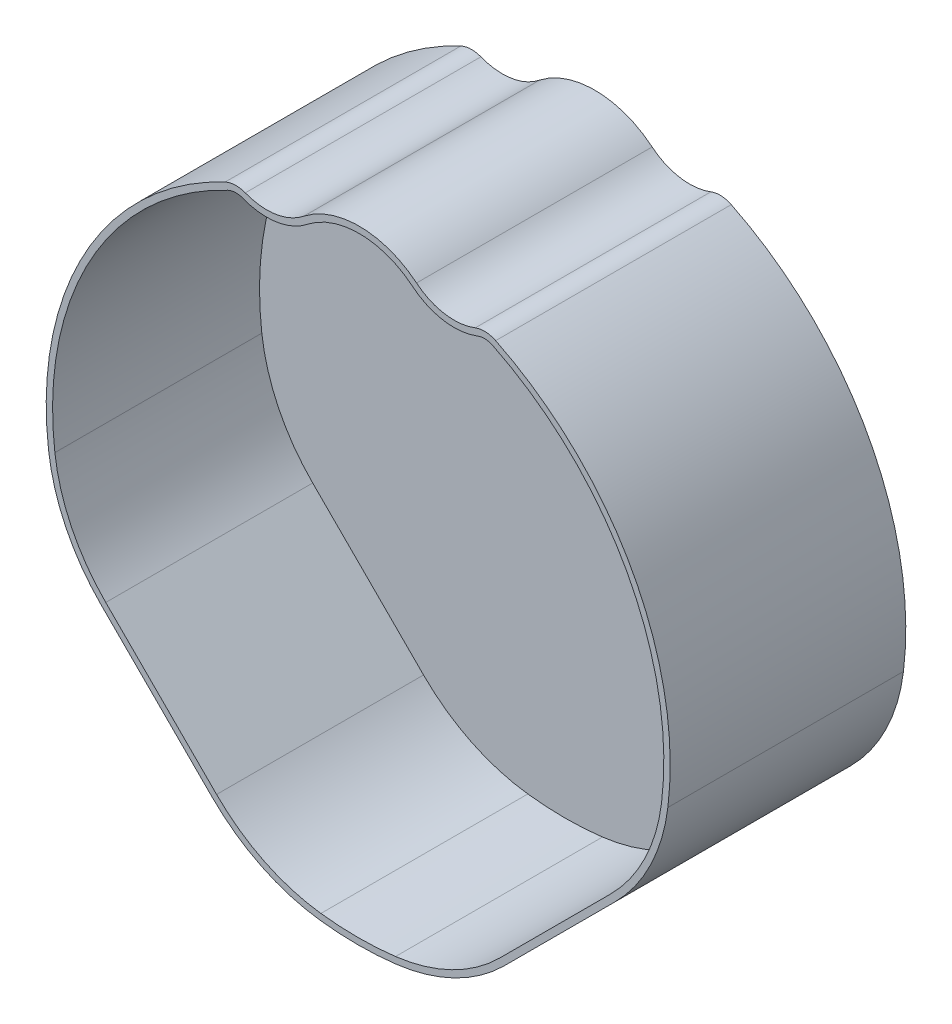
ISO-10303-21;
HEADER;
FILE_DESCRIPTION(('STEP AP214'),'2;1');
FILE_NAME('part.step','',(''),(''),'','','');
FILE_SCHEMA(('AUTOMOTIVE_DESIGN { 1 0 10303 214 1 1 1 1 }'));
ENDSEC;
DATA;
#1=APPLICATION_CONTEXT('core data for automotive mechanical design processes');
#2=APPLICATION_PROTOCOL_DEFINITION('international standard','automotive_design',2000,#1);
#3=PRODUCT_CONTEXT('',#1,'mechanical');
#4=PRODUCT('Part','Part','',(#3));
#5=PRODUCT_RELATED_PRODUCT_CATEGORY('part','',(#4));
#6=PRODUCT_DEFINITION_FORMATION('','',#4);
#7=PRODUCT_DEFINITION_CONTEXT('part definition',#1,'design');
#8=PRODUCT_DEFINITION('design','',#6,#7);
#9=PRODUCT_DEFINITION_SHAPE('','',#8);
#10=(LENGTH_UNIT() NAMED_UNIT(*) SI_UNIT(.MILLI.,.METRE.));
#11=(NAMED_UNIT(*) PLANE_ANGLE_UNIT() SI_UNIT($,.RADIAN.));
#12=(NAMED_UNIT(*) SI_UNIT($,.STERADIAN.) SOLID_ANGLE_UNIT());
#13=UNCERTAINTY_MEASURE_WITH_UNIT(LENGTH_MEASURE(1.E-05),#10,'distance_accuracy_value','');
#14=(GEOMETRIC_REPRESENTATION_CONTEXT(3) GLOBAL_UNCERTAINTY_ASSIGNED_CONTEXT((#13)) GLOBAL_UNIT_ASSIGNED_CONTEXT((#10,
#11,#12)) REPRESENTATION_CONTEXT('',''));
#15=CARTESIAN_POINT('',(0.,0.,0.));
#16=DIRECTION('',(0.,0.,1.));
#17=DIRECTION('',(1.,0.,0.));
#18=AXIS2_PLACEMENT_3D('',#15,#16,#17);
#19=CARTESIAN_POINT('',(-19.1868133898864,40.7046212602657,37.));
#20=DIRECTION('',(0.,0.,-1.));
#21=DIRECTION('',(-1.,0.,0.));
#22=AXIS2_PLACEMENT_3D('',#19,#20,#21);
#23=CYLINDRICAL_SURFACE('',#22,4.00000000000003);
#24=CARTESIAN_POINT('',(-19.1868133898864,40.7046212602657,0.));
#25=DIRECTION('',(0.,0.,1.));
#26=DIRECTION('',(-1.,0.,0.));
#27=AXIS2_PLACEMENT_3D('',#24,#25,#26);
#28=CIRCLE('',#27,4.00000000000003);
#29=CARTESIAN_POINT('',(-17.7314134403251,44.4304515015431,0.));
#30=VERTEX_POINT('',#29);
#31=CARTESIAN_POINT('',(-20.8923079134318,44.3228098167339,0.));
#32=VERTEX_POINT('',#31);
#33=EDGE_CURVE('E183',#30,#32,#28,.T.);
#34=ORIENTED_EDGE('',*,*,#33,.T.);
#35=DIRECTION('',(0.,0.,-1.));
#36=VECTOR('',#35,1.);
#37=CARTESIAN_POINT('',(-20.8923079134318,44.3228098167339,37.));
#38=LINE('',#37,#36);
#39=CARTESIAN_POINT('',(-20.8923079134318,44.3228098167339,37.));
#40=VERTEX_POINT('',#39);
#41=EDGE_CURVE('E11',#40,#32,#38,.T.);
#42=ORIENTED_EDGE('',*,*,#41,.F.);
#43=CARTESIAN_POINT('',(-19.1868133898864,40.7046212602657,37.));
#44=DIRECTION('',(0.,0.,1.));
#45=DIRECTION('',(-1.,0.,0.));
#46=AXIS2_PLACEMENT_3D('',#43,#44,#45);
#47=CIRCLE('',#46,4.00000000000003);
#48=CARTESIAN_POINT('',(-17.7314134403251,44.4304515015431,37.));
#49=VERTEX_POINT('',#48);
#50=EDGE_CURVE('E211',#49,#40,#47,.T.);
#51=ORIENTED_EDGE('',*,*,#50,.F.);
#52=DIRECTION('',(0.,0.,-1.));
#53=VECTOR('',#52,1.);
#54=CARTESIAN_POINT('',(-17.7314134403251,44.4304515015431,37.));
#55=LINE('',#54,#53);
#56=EDGE_CURVE('E179',#49,#30,#55,.T.);
#57=ORIENTED_EDGE('',*,*,#56,.T.);
#58=EDGE_LOOP('',(#34,#42,#51,#57));
#59=FACE_BOUND('',#58,.T.);
#60=ADVANCED_FACE('F39',(#59),#23,.T.);
#61=CARTESIAN_POINT('',(3.40005801291454E-13,-1.90819582357449E-13,37.));
#62=DIRECTION('',(0.,0.,-1.));
#63=DIRECTION('',(-1.,0.,0.));
#64=AXIS2_PLACEMENT_3D('',#61,#62,#63);
#65=CYLINDRICAL_SURFACE('',#64,49.0000000000003);
#66=CARTESIAN_POINT('',(3.40005801291454E-13,-1.90819582357449E-13,0.));
#67=DIRECTION('',(0.,0.,1.));
#68=DIRECTION('',(-1.,0.,0.));
#69=AXIS2_PLACEMENT_3D('',#66,#67,#68);
#70=CIRCLE('',#69,49.0000000000003);
#71=CARTESIAN_POINT('',(-48.6335744198468,-5.98125732177025,0.));
#72=VERTEX_POINT('',#71);
#73=EDGE_CURVE('E186',#32,#72,#70,.T.);
#74=ORIENTED_EDGE('',*,*,#73,.T.);
#75=DIRECTION('',(0.,0.,-1.));
#76=VECTOR('',#75,1.);
#77=CARTESIAN_POINT('',(-48.6335744198468,-5.98125732177025,37.));
#78=LINE('',#77,#76);
#79=CARTESIAN_POINT('',(-48.6335744198468,-5.98125732177025,37.));
#80=VERTEX_POINT('',#79);
#81=EDGE_CURVE('E46',#80,#72,#78,.T.);
#82=ORIENTED_EDGE('',*,*,#81,.F.);
#83=CARTESIAN_POINT('',(3.40005801291454E-13,-1.90819582357449E-13,37.));
#84=DIRECTION('',(0.,0.,1.));
#85=DIRECTION('',(-1.,0.,0.));
#86=AXIS2_PLACEMENT_3D('',#83,#84,#85);
#87=CIRCLE('',#86,49.0000000000003);
#88=EDGE_CURVE('E121',#40,#80,#87,.T.);
#89=ORIENTED_EDGE('',*,*,#88,.F.);
#90=ORIENTED_EDGE('',*,*,#41,.T.);
#91=EDGE_LOOP('',(#74,#82,#89,#90));
#92=FACE_BOUND('',#91,.T.);
#93=ADVANCED_FACE('F541',(#92),#65,.T.);
#94=CARTESIAN_POINT('',(-19.8504385387125,-2.44132951908984,37.));
#95=DIRECTION('',(0.,0.,-1.));
#96=DIRECTION('',(-1.,0.,0.));
#97=AXIS2_PLACEMENT_3D('',#94,#95,#96);
#98=CYLINDRICAL_SURFACE('',#97,29.0000000000004);
#99=CARTESIAN_POINT('',(-19.8504385387125,-2.44132951908984,0.));
#100=DIRECTION('',(0.,0.,1.));
#101=DIRECTION('',(-1.,0.,0.));
#102=AXIS2_PLACEMENT_3D('',#99,#100,#101);
#103=CIRCLE('',#102,29.0000000000004);
#104=CARTESIAN_POINT('',(-40.3565351931228,-22.9474261735,0.));
#105=VERTEX_POINT('',#104);
#106=EDGE_CURVE('E189',#72,#105,#103,.T.);
#107=ORIENTED_EDGE('',*,*,#106,.T.);
#108=DIRECTION('',(0.,0.,-1.));
#109=VECTOR('',#108,1.);
#110=CARTESIAN_POINT('',(-40.3565351931228,-22.9474261735,37.));
#111=LINE('',#110,#109);
#112=CARTESIAN_POINT('',(-40.3565351931228,-22.9474261735,37.));
#113=VERTEX_POINT('',#112);
#114=EDGE_CURVE('E236',#113,#105,#111,.T.);
#115=ORIENTED_EDGE('',*,*,#114,.F.);
#116=CARTESIAN_POINT('',(-19.8504385387125,-2.44132951908984,37.));
#117=DIRECTION('',(0.,0.,1.));
#118=DIRECTION('',(-1.,0.,0.));
#119=AXIS2_PLACEMENT_3D('',#116,#117,#118);
#120=CIRCLE('',#119,29.0000000000004);
#121=EDGE_CURVE('E244',#80,#113,#120,.T.);
#122=ORIENTED_EDGE('',*,*,#121,.F.);
#123=ORIENTED_EDGE('',*,*,#81,.T.);
#124=EDGE_LOOP('',(#107,#115,#122,#123));
#125=FACE_BOUND('',#124,.T.);
#126=ADVANCED_FACE('F242',(#125),#98,.T.);
#127=CARTESIAN_POINT('',(-22.9474261735,-40.3565351931227,37.));
#128=DIRECTION('',(0.707106781186547,0.707106781186548,0.));
#129=DIRECTION('',(-0.707106781186548,0.707106781186547,0.));
#130=AXIS2_PLACEMENT_3D('',#127,#128,#129);
#131=PLANE('',#130);
#132=DIRECTION('',(0.707106781186548,-0.707106781186547,0.));
#133=VECTOR('',#132,1.);
#134=CARTESIAN_POINT('',(-22.9474261735,-40.3565351931227,0.));
#135=LINE('',#134,#133);
#136=CARTESIAN_POINT('',(-22.9474261735001,-40.3565351931228,0.));
#137=VERTEX_POINT('',#136);
#138=EDGE_CURVE('E191',#105,#137,#135,.T.);
#139=ORIENTED_EDGE('',*,*,#138,.T.);
#140=DIRECTION('',(0.,0.,-1.));
#141=VECTOR('',#140,1.);
#142=CARTESIAN_POINT('',(-22.9474261735001,-40.3565351931228,37.));
#143=LINE('',#142,#141);
#144=CARTESIAN_POINT('',(-22.9474261735001,-40.3565351931228,37.));
#145=VERTEX_POINT('',#144);
#146=EDGE_CURVE('E233',#145,#137,#143,.T.);
#147=ORIENTED_EDGE('',*,*,#146,.F.);
#148=DIRECTION('',(0.707106781186548,-0.707106781186547,0.));
#149=VECTOR('',#148,1.);
#150=CARTESIAN_POINT('',(-22.9474261735,-40.3565351931227,37.));
#151=LINE('',#150,#149);
#152=EDGE_CURVE('E262',#113,#145,#151,.T.);
#153=ORIENTED_EDGE('',*,*,#152,.F.);
#154=ORIENTED_EDGE('',*,*,#114,.T.);
#155=EDGE_LOOP('',(#139,#147,#153,#154));
#156=FACE_BOUND('',#155,.T.);
#157=ADVANCED_FACE('F253',(#156),#131,.F.);
#158=CARTESIAN_POINT('',(-2.44132951909014,-19.8504385387124,37.));
#159=DIRECTION('',(0.,0.,-1.));
#160=DIRECTION('',(-1.,0.,0.));
#161=AXIS2_PLACEMENT_3D('',#158,#159,#160);
#162=CYLINDRICAL_SURFACE('',#161,29.0000000000004);
#163=CARTESIAN_POINT('',(-2.44132951909014,-19.8504385387124,0.));
#164=DIRECTION('',(0.,0.,1.));
#165=DIRECTION('',(-1.,0.,0.));
#166=AXIS2_PLACEMENT_3D('',#163,#164,#165);
#167=CIRCLE('',#166,29.0000000000004);
#168=CARTESIAN_POINT('',(-5.98125732177079,-48.6335744198467,0.));
#169=VERTEX_POINT('',#168);
#170=EDGE_CURVE('E193',#137,#169,#167,.T.);
#171=ORIENTED_EDGE('',*,*,#170,.T.);
#172=DIRECTION('',(0.,0.,-1.));
#173=VECTOR('',#172,1.);
#174=CARTESIAN_POINT('',(-5.98125732177079,-48.6335744198467,37.));
#175=LINE('',#174,#173);
#176=CARTESIAN_POINT('',(-5.98125732177079,-48.6335744198467,37.));
#177=VERTEX_POINT('',#176);
#178=EDGE_CURVE('E230',#177,#169,#175,.T.);
#179=ORIENTED_EDGE('',*,*,#178,.F.);
#180=CARTESIAN_POINT('',(-2.44132951909014,-19.8504385387124,37.));
#181=DIRECTION('',(0.,0.,1.));
#182=DIRECTION('',(-1.,0.,0.));
#183=AXIS2_PLACEMENT_3D('',#180,#181,#182);
#184=CIRCLE('',#183,29.0000000000004);
#185=EDGE_CURVE('E259',#145,#177,#184,.T.);
#186=ORIENTED_EDGE('',*,*,#185,.F.);
#187=ORIENTED_EDGE('',*,*,#146,.T.);
#188=EDGE_LOOP('',(#171,#179,#186,#187));
#189=FACE_BOUND('',#188,.T.);
#190=ADVANCED_FACE('F257',(#189),#162,.T.);
#191=CARTESIAN_POINT('',(0.,3.81639164714898E-13,37.));
#192=DIRECTION('',(0.,0.,-1.));
#193=DIRECTION('',(-1.,0.,0.));
#194=AXIS2_PLACEMENT_3D('',#191,#192,#193);
#195=CYLINDRICAL_SURFACE('',#194,49.0000000000004);
#196=CARTESIAN_POINT('',(0.,3.81639164714898E-13,0.));
#197=DIRECTION('',(0.,0.,1.));
#198=DIRECTION('',(-1.,0.,0.));
#199=AXIS2_PLACEMENT_3D('',#196,#197,#198);
#200=CIRCLE('',#199,49.0000000000004);
#201=CARTESIAN_POINT('',(5.98125732177026,-48.6335744198468,0.));
#202=VERTEX_POINT('',#201);
#203=EDGE_CURVE('E195',#169,#202,#200,.T.);
#204=ORIENTED_EDGE('',*,*,#203,.T.);
#205=DIRECTION('',(0.,0.,-1.));
#206=VECTOR('',#205,1.);
#207=CARTESIAN_POINT('',(5.98125732177026,-48.6335744198468,37.));
#208=LINE('',#207,#206);
#209=CARTESIAN_POINT('',(5.98125732177026,-48.6335744198468,37.));
#210=VERTEX_POINT('',#209);
#211=EDGE_CURVE('E227',#210,#202,#208,.T.);
#212=ORIENTED_EDGE('',*,*,#211,.F.);
#213=CARTESIAN_POINT('',(0.,3.81639164714898E-13,37.));
#214=DIRECTION('',(0.,0.,1.));
#215=DIRECTION('',(-1.,0.,0.));
#216=AXIS2_PLACEMENT_3D('',#213,#214,#215);
#217=CIRCLE('',#216,49.0000000000004);
#218=EDGE_CURVE('E261',#177,#210,#217,.T.);
#219=ORIENTED_EDGE('',*,*,#218,.F.);
#220=ORIENTED_EDGE('',*,*,#178,.T.);
#221=EDGE_LOOP('',(#204,#212,#219,#220));
#222=FACE_BOUND('',#221,.T.);
#223=ADVANCED_FACE('F554',(#222),#195,.T.);
#224=CARTESIAN_POINT('',(2.44132951908985,-19.8504385387125,37.));
#225=DIRECTION('',(0.,0.,-1.));
#226=DIRECTION('',(-1.,0.,0.));
#227=AXIS2_PLACEMENT_3D('',#224,#225,#226);
#228=CYLINDRICAL_SURFACE('',#227,29.0000000000004);
#229=CARTESIAN_POINT('',(2.44132951908985,-19.8504385387125,0.));
#230=DIRECTION('',(0.,0.,1.));
#231=DIRECTION('',(-1.,0.,0.));
#232=AXIS2_PLACEMENT_3D('',#229,#230,#231);
#233=CIRCLE('',#232,29.0000000000004);
#234=CARTESIAN_POINT('',(22.9474261735,-40.3565351931227,0.));
#235=VERTEX_POINT('',#234);
#236=EDGE_CURVE('E197',#202,#235,#233,.T.);
#237=ORIENTED_EDGE('',*,*,#236,.T.);
#238=DIRECTION('',(0.,0.,-1.));
#239=VECTOR('',#238,1.);
#240=CARTESIAN_POINT('',(22.9474261735,-40.3565351931227,37.));
#241=LINE('',#240,#239);
#242=CARTESIAN_POINT('',(22.9474261735,-40.3565351931227,37.));
#243=VERTEX_POINT('',#242);
#244=EDGE_CURVE('E224',#243,#235,#241,.T.);
#245=ORIENTED_EDGE('',*,*,#244,.F.);
#246=CARTESIAN_POINT('',(2.44132951908985,-19.8504385387125,37.));
#247=DIRECTION('',(0.,0.,1.));
#248=DIRECTION('',(-1.,0.,0.));
#249=AXIS2_PLACEMENT_3D('',#246,#247,#248);
#250=CIRCLE('',#249,29.0000000000004);
#251=EDGE_CURVE('E264',#210,#243,#250,.T.);
#252=ORIENTED_EDGE('',*,*,#251,.F.);
#253=ORIENTED_EDGE('',*,*,#211,.T.);
#254=EDGE_LOOP('',(#237,#245,#252,#253));
#255=FACE_BOUND('',#254,.T.);
#256=ADVANCED_FACE('F557',(#255),#228,.T.);
#257=CARTESIAN_POINT('',(40.3565351931228,-22.9474261735,37.));
#258=DIRECTION('',(-0.707106781186547,0.707106781186548,0.));
#259=DIRECTION('',(-0.707106781186548,-0.707106781186547,0.));
#260=AXIS2_PLACEMENT_3D('',#257,#258,#259);
#261=PLANE('',#260);
#262=DIRECTION('',(0.707106781186548,0.707106781186547,0.));
#263=VECTOR('',#262,1.);
#264=CARTESIAN_POINT('',(40.3565351931228,-22.9474261735,0.));
#265=LINE('',#264,#263);
#266=CARTESIAN_POINT('',(40.3565351931227,-22.9474261735,0.));
#267=VERTEX_POINT('',#266);
#268=EDGE_CURVE('E199',#235,#267,#265,.T.);
#269=ORIENTED_EDGE('',*,*,#268,.T.);
#270=DIRECTION('',(0.,0.,-1.));
#271=VECTOR('',#270,1.);
#272=CARTESIAN_POINT('',(40.3565351931227,-22.9474261735,37.));
#273=LINE('',#272,#271);
#274=CARTESIAN_POINT('',(40.3565351931227,-22.9474261735,37.));
#275=VERTEX_POINT('',#274);
#276=EDGE_CURVE('E221',#275,#267,#273,.T.);
#277=ORIENTED_EDGE('',*,*,#276,.F.);
#278=DIRECTION('',(0.707106781186548,0.707106781186547,0.));
#279=VECTOR('',#278,1.);
#280=CARTESIAN_POINT('',(40.3565351931228,-22.9474261735,37.));
#281=LINE('',#280,#279);
#282=EDGE_CURVE('E270',#243,#275,#281,.T.);
#283=ORIENTED_EDGE('',*,*,#282,.F.);
#284=ORIENTED_EDGE('',*,*,#244,.T.);
#285=EDGE_LOOP('',(#269,#277,#283,#284));
#286=FACE_BOUND('',#285,.T.);
#287=ADVANCED_FACE('F561',(#286),#261,.F.);
#288=CARTESIAN_POINT('',(19.8504385387125,-2.44132951908984,37.));
#289=DIRECTION('',(0.,0.,-1.));
#290=DIRECTION('',(-1.,0.,0.));
#291=AXIS2_PLACEMENT_3D('',#288,#289,#290);
#292=CYLINDRICAL_SURFACE('',#291,29.0000000000004);
#293=CARTESIAN_POINT('',(19.8504385387125,-2.44132951908984,0.));
#294=DIRECTION('',(0.,0.,1.));
#295=DIRECTION('',(-1.,0.,0.));
#296=AXIS2_PLACEMENT_3D('',#293,#294,#295);
#297=CIRCLE('',#296,29.0000000000004);
#298=CARTESIAN_POINT('',(48.6335744198467,-5.98125732177058,0.));
#299=VERTEX_POINT('',#298);
#300=EDGE_CURVE('E201',#267,#299,#297,.T.);
#301=ORIENTED_EDGE('',*,*,#300,.T.);
#302=DIRECTION('',(0.,0.,-1.));
#303=VECTOR('',#302,1.);
#304=CARTESIAN_POINT('',(48.6335744198467,-5.98125732177058,37.));
#305=LINE('',#304,#303);
#306=CARTESIAN_POINT('',(48.6335744198467,-5.98125732177058,37.));
#307=VERTEX_POINT('',#306);
#308=EDGE_CURVE('E218',#307,#299,#305,.T.);
#309=ORIENTED_EDGE('',*,*,#308,.F.);
#310=CARTESIAN_POINT('',(19.8504385387125,-2.44132951908984,37.));
#311=DIRECTION('',(0.,0.,1.));
#312=DIRECTION('',(-1.,0.,0.));
#313=AXIS2_PLACEMENT_3D('',#310,#311,#312);
#314=CIRCLE('',#313,29.0000000000004);
#315=EDGE_CURVE('E272',#275,#307,#314,.T.);
#316=ORIENTED_EDGE('',*,*,#315,.F.);
#317=ORIENTED_EDGE('',*,*,#276,.T.);
#318=EDGE_LOOP('',(#301,#309,#316,#317));
#319=FACE_BOUND('',#318,.T.);
#320=ADVANCED_FACE('F565',(#319),#292,.T.);
#321=CARTESIAN_POINT('',(-4.30211422042248E-13,-2.28983498828939E-13,37.));
#322=DIRECTION('',(0.,0.,-1.));
#323=DIRECTION('',(-1.,0.,0.));
#324=AXIS2_PLACEMENT_3D('',#321,#322,#323);
#325=CYLINDRICAL_SURFACE('',#324,49.0000000000004);
#326=CARTESIAN_POINT('',(-4.30211422042248E-13,-2.28983498828939E-13,0.));
#327=DIRECTION('',(0.,0.,1.));
#328=DIRECTION('',(-1.,0.,0.));
#329=AXIS2_PLACEMENT_3D('',#326,#327,#328);
#330=CIRCLE('',#329,49.0000000000004);
#331=CARTESIAN_POINT('',(21.5891340464944,43.9876038347453,0.));
#332=VERTEX_POINT('',#331);
#333=EDGE_CURVE('E203',#299,#332,#330,.T.);
#334=ORIENTED_EDGE('',*,*,#333,.T.);
#335=DIRECTION('',(0.,0.,-1.));
#336=VECTOR('',#335,1.);
#337=CARTESIAN_POINT('',(21.5891340464944,43.9876038347453,37.));
#338=LINE('',#337,#336);
#339=CARTESIAN_POINT('',(21.5891340464944,43.9876038347453,37.));
#340=VERTEX_POINT('',#339);
#341=EDGE_CURVE('E215',#340,#332,#338,.T.);
#342=ORIENTED_EDGE('',*,*,#341,.F.);
#343=CARTESIAN_POINT('',(-4.30211422042248E-13,-2.28983498828939E-13,37.));
#344=DIRECTION('',(0.,0.,1.));
#345=DIRECTION('',(-1.,0.,0.));
#346=AXIS2_PLACEMENT_3D('',#343,#344,#345);
#347=CIRCLE('',#346,49.0000000000004);
#348=EDGE_CURVE('E274',#307,#340,#347,.T.);
#349=ORIENTED_EDGE('',*,*,#348,.F.);
#350=ORIENTED_EDGE('',*,*,#308,.T.);
#351=EDGE_LOOP('',(#334,#342,#349,#350));
#352=FACE_BOUND('',#351,.T.);
#353=ADVANCED_FACE('F280',(#352),#325,.T.);
#354=CARTESIAN_POINT('',(19.8267557569846,40.3967790319089,37.));
#355=DIRECTION('',(0.,0.,-1.));
#356=DIRECTION('',(-1.,0.,0.));
#357=AXIS2_PLACEMENT_3D('',#354,#355,#356);
#358=CYLINDRICAL_SURFACE('',#357,3.99999999999999);
#359=CARTESIAN_POINT('',(19.8267557569846,40.3967790319089,0.));
#360=DIRECTION('',(0.,0.,1.));
#361=DIRECTION('',(-1.,0.,0.));
#362=AXIS2_PLACEMENT_3D('',#359,#360,#361);
#363=CIRCLE('',#362,3.99999999999999);
#364=CARTESIAN_POINT('',(18.3858789707305,44.128249799158,0.));
#365=VERTEX_POINT('',#364);
#366=EDGE_CURVE('E205',#332,#365,#363,.T.);
#367=ORIENTED_EDGE('',*,*,#366,.T.);
#368=DIRECTION('',(0.,0.,-1.));
#369=VECTOR('',#368,1.);
#370=CARTESIAN_POINT('',(18.3858789707305,44.128249799158,37.));
#371=LINE('',#370,#369);
#372=CARTESIAN_POINT('',(18.3858789707305,44.128249799158,37.));
#373=VERTEX_POINT('',#372);
#374=EDGE_CURVE('E174',#373,#365,#371,.T.);
#375=ORIENTED_EDGE('',*,*,#374,.F.);
#376=CARTESIAN_POINT('',(19.8267557569846,40.3967790319089,37.));
#377=DIRECTION('',(0.,0.,1.));
#378=DIRECTION('',(-1.,0.,0.));
#379=AXIS2_PLACEMENT_3D('',#376,#377,#378);
#380=CIRCLE('',#379,3.99999999999999);
#381=EDGE_CURVE('E162',#340,#373,#380,.T.);
#382=ORIENTED_EDGE('',*,*,#381,.F.);
#383=ORIENTED_EDGE('',*,*,#341,.T.);
#384=EDGE_LOOP('',(#367,#375,#382,#383));
#385=FACE_BOUND('',#384,.T.);
#386=ADVANCED_FACE('F284',(#385),#358,.T.);
#387=CARTESIAN_POINT('',(15.0516529774282,52.7629692589351,37.));
#388=DIRECTION('',(0.,0.,-1.));
#389=DIRECTION('',(-1.,0.,0.));
#390=AXIS2_PLACEMENT_3D('',#387,#388,#389);
#391=CYLINDRICAL_SURFACE('',#390,9.25610302035729);
#392=CARTESIAN_POINT('',(15.0516529774282,52.7629692589351,0.));
#393=DIRECTION('',(0.,0.,-1.));
#394=DIRECTION('',(1.,0.,0.));
#395=AXIS2_PLACEMENT_3D('',#392,#393,#394);
#396=CIRCLE('',#395,9.25610302035729);
#397=CARTESIAN_POINT('',(9.16390656983445,45.6208487500573,0.));
#398=VERTEX_POINT('',#397);
#399=EDGE_CURVE('E171',#365,#398,#396,.T.);
#400=ORIENTED_EDGE('',*,*,#399,.T.);
#401=DIRECTION('',(0.,0.,-1.));
#402=VECTOR('',#401,1.);
#403=CARTESIAN_POINT('',(9.16390656983445,45.6208487500573,37.));
#404=LINE('',#403,#402);
#405=CARTESIAN_POINT('',(9.16390656983445,45.6208487500573,37.));
#406=VERTEX_POINT('',#405);
#407=EDGE_CURVE('E168',#406,#398,#404,.T.);
#408=ORIENTED_EDGE('',*,*,#407,.F.);
#409=CARTESIAN_POINT('',(15.0516529774282,52.7629692589351,37.));
#410=DIRECTION('',(0.,0.,-1.));
#411=DIRECTION('',(1.,0.,0.));
#412=AXIS2_PLACEMENT_3D('',#409,#410,#411);
#413=CIRCLE('',#412,9.25610302035729);
#414=EDGE_CURVE('E155',#373,#406,#413,.T.);
#415=ORIENTED_EDGE('',*,*,#414,.F.);
#416=ORIENTED_EDGE('',*,*,#374,.T.);
#417=EDGE_LOOP('',(#400,#408,#415,#416));
#418=FACE_BOUND('',#417,.T.);
#419=ADVANCED_FACE('F169',(#418),#391,.F.);
#420=CARTESIAN_POINT('',(0.163093868653947,34.7024286043191,37.));
#421=DIRECTION('',(0.,0.,-1.));
#422=DIRECTION('',(-1.,0.,0.));
#423=AXIS2_PLACEMENT_3D('',#420,#421,#422);
#424=CYLINDRICAL_SURFACE('',#423,14.1501423229801);
#425=CARTESIAN_POINT('',(0.163093868653947,34.7024286043191,0.));
#426=DIRECTION('',(0.,0.,1.));
#427=DIRECTION('',(-1.,0.,0.));
#428=AXIS2_PLACEMENT_3D('',#425,#426,#427);
#429=CIRCLE('',#428,14.1501423229801);
#430=CARTESIAN_POINT('',(-8.48817840463089,45.8998397253813,0.));
#431=VERTEX_POINT('',#430);
#432=EDGE_CURVE('E208',#398,#431,#429,.T.);
#433=ORIENTED_EDGE('',*,*,#432,.T.);
#434=DIRECTION('',(0.,0.,-1.));
#435=VECTOR('',#434,1.);
#436=CARTESIAN_POINT('',(-8.48817840463089,45.8998397253813,37.));
#437=LINE('',#436,#435);
#438=CARTESIAN_POINT('',(-8.48817840463089,45.8998397253813,37.));
#439=VERTEX_POINT('',#438);
#440=EDGE_CURVE('E175',#439,#431,#437,.T.);
#441=ORIENTED_EDGE('',*,*,#440,.F.);
#442=CARTESIAN_POINT('',(0.163093868653947,34.7024286043191,37.));
#443=DIRECTION('',(0.,0.,1.));
#444=DIRECTION('',(-1.,0.,0.));
#445=AXIS2_PLACEMENT_3D('',#442,#443,#444);
#446=CIRCLE('',#445,14.1501423229801);
#447=EDGE_CURVE('E159',#406,#439,#446,.T.);
#448=ORIENTED_EDGE('',*,*,#447,.F.);
#449=ORIENTED_EDGE('',*,*,#407,.T.);
#450=EDGE_LOOP('',(#433,#441,#448,#449));
#451=FACE_BOUND('',#450,.T.);
#452=ADVANCED_FACE('F177',(#451),#424,.T.);
#453=CARTESIAN_POINT('',(-14.3635804730848,53.0521186389498,37.));
#454=DIRECTION('',(0.,0.,-1.));
#455=DIRECTION('',(-1.,0.,0.));
#456=AXIS2_PLACEMENT_3D('',#453,#454,#455);
#457=CYLINDRICAL_SURFACE('',#456,9.25610302035743);
#458=CARTESIAN_POINT('',(-14.3635804730848,53.0521186389498,0.));
#459=DIRECTION('',(0.,0.,-1.));
#460=DIRECTION('',(1.,0.,0.));
#461=AXIS2_PLACEMENT_3D('',#458,#459,#460);
#462=CIRCLE('',#461,9.25610302035743);
#463=EDGE_CURVE('E113',#431,#30,#462,.T.);
#464=ORIENTED_EDGE('',*,*,#463,.T.);
#465=ORIENTED_EDGE('',*,*,#56,.F.);
#466=CARTESIAN_POINT('',(-14.3635804730848,53.0521186389498,37.));
#467=DIRECTION('',(0.,0.,-1.));
#468=DIRECTION('',(1.,0.,0.));
#469=AXIS2_PLACEMENT_3D('',#466,#467,#468);
#470=CIRCLE('',#469,9.25610302035743);
#471=EDGE_CURVE('E62',#439,#49,#470,.T.);
#472=ORIENTED_EDGE('',*,*,#471,.F.);
#473=ORIENTED_EDGE('',*,*,#440,.T.);
#474=EDGE_LOOP('',(#464,#465,#472,#473));
#475=FACE_BOUND('',#474,.T.);
#476=ADVANCED_FACE('F285',(#475),#457,.F.);
#477=CARTESIAN_POINT('',(-19.1868133898864,40.7046212602657,37.));
#478=DIRECTION('',(0.,0.,-1.));
#479=DIRECTION('',(-1.,0.,0.));
#480=AXIS2_PLACEMENT_3D('',#477,#478,#479);
#481=PLANE('',#480);
#482=CARTESIAN_POINT('',(-19.1868133898864,40.7046212602657,37.));
#483=DIRECTION('',(0.,0.,1.));
#484=DIRECTION('',(1.,0.,0.));
#485=AXIS2_PLACEMENT_3D('',#482,#483,#484);
#486=CIRCLE('',#485,3.00000000000003);
#487=CARTESIAN_POINT('',(-18.0952634277154,43.4989939412238,37.));
#488=VERTEX_POINT('',#487);
#489=CARTESIAN_POINT('',(-20.4659342825454,43.4182626776168,37.));
#490=VERTEX_POINT('',#489);
#491=EDGE_CURVE('E369',#488,#490,#486,.T.);
#492=ORIENTED_EDGE('',*,*,#491,.F.);
#493=CARTESIAN_POINT('',(-14.3635804730848,53.0521186389498,37.));
#494=DIRECTION('',(0.,0.,-1.));
#495=DIRECTION('',(1.,0.,0.));
#496=AXIS2_PLACEMENT_3D('',#493,#494,#495);
#497=CIRCLE('',#496,10.2561030203575);
#498=CARTESIAN_POINT('',(-7.86547864388288,45.1172385654068,37.));
#499=VERTEX_POINT('',#498);
#500=EDGE_CURVE('E53',#499,#488,#497,.T.);
#501=ORIENTED_EDGE('',*,*,#500,.F.);
#502=CARTESIAN_POINT('',(0.163093868653947,34.7024286043191,37.));
#503=DIRECTION('',(0.,0.,1.));
#504=DIRECTION('',(1.,0.,0.));
#505=AXIS2_PLACEMENT_3D('',#502,#503,#504);
#506=CIRCLE('',#505,13.1501423229802);
#507=CARTESIAN_POINT('',(8.52781313022551,44.8492367127701,37.));
#508=VERTEX_POINT('',#507);
#509=EDGE_CURVE('E332',#508,#499,#506,.T.);
#510=ORIENTED_EDGE('',*,*,#509,.F.);
#511=CARTESIAN_POINT('',(15.0516529774282,52.7629692589351,37.));
#512=DIRECTION('',(0.,0.,-1.));
#513=DIRECTION('',(1.,0.,0.));
#514=AXIS2_PLACEMENT_3D('',#511,#512,#513);
#515=CIRCLE('',#514,10.2561030203573);
#516=CARTESIAN_POINT('',(18.7460981672941,43.1953821073457,37.));
#517=VERTEX_POINT('',#516);
#518=EDGE_CURVE('E336',#517,#508,#515,.T.);
#519=ORIENTED_EDGE('',*,*,#518,.F.);
#520=CARTESIAN_POINT('',(19.8267557569846,40.3967790319089,37.));
#521=DIRECTION('',(0.,0.,1.));
#522=DIRECTION('',(1.,0.,0.));
#523=AXIS2_PLACEMENT_3D('',#520,#521,#522);
#524=CIRCLE('',#523,2.99999999999999);
#525=CARTESIAN_POINT('',(21.1485394741169,43.0898976340362,37.));
#526=VERTEX_POINT('',#525);
#527=EDGE_CURVE('E339',#526,#517,#524,.T.);
#528=ORIENTED_EDGE('',*,*,#527,.F.);
#529=CARTESIAN_POINT('',(-4.30211422042248E-13,-2.28983498828939E-13,37.));
#530=DIRECTION('',(0.,0.,1.));
#531=DIRECTION('',(1.,0.,0.));
#532=AXIS2_PLACEMENT_3D('',#529,#530,#531);
#533=CIRCLE('',#532,48.0000000000004);
#534=CARTESIAN_POINT('',(47.6410524929111,-5.85919084581607,37.));
#535=VERTEX_POINT('',#534);
#536=EDGE_CURVE('E342',#535,#526,#533,.T.);
#537=ORIENTED_EDGE('',*,*,#536,.F.);
#538=CARTESIAN_POINT('',(19.8504385387125,-2.44132951908984,37.));
#539=DIRECTION('',(0.,0.,1.));
#540=DIRECTION('',(1.,0.,0.));
#541=AXIS2_PLACEMENT_3D('',#538,#539,#540);
#542=CIRCLE('',#541,28.0000000000004);
#543=CARTESIAN_POINT('',(39.6494284119362,-22.2403193923135,37.));
#544=VERTEX_POINT('',#543);
#545=EDGE_CURVE('E345',#544,#535,#542,.T.);
#546=ORIENTED_EDGE('',*,*,#545,.F.);
#547=DIRECTION('',(0.707106781186547,0.707106781186548,0.));
#548=VECTOR('',#547,1.);
#549=CARTESIAN_POINT('',(22.2403193923135,-39.6494284119362,37.));
#550=LINE('',#549,#548);
#551=CARTESIAN_POINT('',(22.2403193923135,-39.6494284119362,37.));
#552=VERTEX_POINT('',#551);
#553=EDGE_CURVE('E348',#552,#544,#550,.T.);
#554=ORIENTED_EDGE('',*,*,#553,.F.);
#555=CARTESIAN_POINT('',(2.44132951908985,-19.8504385387125,37.));
#556=DIRECTION('',(0.,0.,1.));
#557=DIRECTION('',(1.,0.,0.));
#558=AXIS2_PLACEMENT_3D('',#555,#556,#557);
#559=CIRCLE('',#558,28.0000000000004);
#560=CARTESIAN_POINT('',(5.85919084581575,-47.6410524929111,37.));
#561=VERTEX_POINT('',#560);
#562=EDGE_CURVE('E351',#561,#552,#559,.T.);
#563=ORIENTED_EDGE('',*,*,#562,.F.);
#564=CARTESIAN_POINT('',(0.,3.81639164714898E-13,37.));
#565=DIRECTION('',(0.,0.,1.));
#566=DIRECTION('',(1.,0.,0.));
#567=AXIS2_PLACEMENT_3D('',#564,#565,#566);
#568=CIRCLE('',#567,48.0000000000004);
#569=CARTESIAN_POINT('',(-5.85919084581627,-47.6410524929109,37.));
#570=VERTEX_POINT('',#569);
#571=EDGE_CURVE('E354',#570,#561,#568,.T.);
#572=ORIENTED_EDGE('',*,*,#571,.F.);
#573=CARTESIAN_POINT('',(-2.44132951909014,-19.8504385387124,37.));
#574=DIRECTION('',(0.,0.,1.));
#575=DIRECTION('',(1.,0.,0.));
#576=AXIS2_PLACEMENT_3D('',#573,#574,#575);
#577=CIRCLE('',#576,28.0000000000005);
#578=CARTESIAN_POINT('',(-22.2403193923135,-39.6494284119362,37.));
#579=VERTEX_POINT('',#578);
#580=EDGE_CURVE('E357',#579,#570,#577,.T.);
#581=ORIENTED_EDGE('',*,*,#580,.F.);
#582=DIRECTION('',(0.707106781186545,-0.707106781186549,0.));
#583=VECTOR('',#582,1.);
#584=CARTESIAN_POINT('',(-39.6494284119362,-22.2403193923135,37.));
#585=LINE('',#584,#583);
#586=CARTESIAN_POINT('',(-39.6494284119362,-22.2403193923135,37.));
#587=VERTEX_POINT('',#586);
#588=EDGE_CURVE('E360',#587,#579,#585,.T.);
#589=ORIENTED_EDGE('',*,*,#588,.F.);
#590=CARTESIAN_POINT('',(-19.8504385387125,-2.44132951908984,37.));
#591=DIRECTION('',(0.,0.,1.));
#592=DIRECTION('',(1.,0.,0.));
#593=AXIS2_PLACEMENT_3D('',#590,#591,#592);
#594=CIRCLE('',#593,28.0000000000004);
#595=CARTESIAN_POINT('',(-47.6410524929111,-5.85919084581572,37.));
#596=VERTEX_POINT('',#595);
#597=EDGE_CURVE('E363',#596,#587,#594,.T.);
#598=ORIENTED_EDGE('',*,*,#597,.F.);
#599=CARTESIAN_POINT('',(3.40005801291454E-13,-1.90819582357449E-13,37.));
#600=DIRECTION('',(0.,0.,1.));
#601=DIRECTION('',(1.,0.,0.));
#602=AXIS2_PLACEMENT_3D('',#599,#600,#601);
#603=CIRCLE('',#602,48.0000000000003);
#604=EDGE_CURVE('E366',#490,#596,#603,.T.);
#605=ORIENTED_EDGE('',*,*,#604,.F.);
#606=EDGE_LOOP('',(#492,#501,#510,#519,#528,#537,#546,#554,#563,#572,#581,#589,#598,#605));
#607=FACE_BOUND('',#606,.T.);
#608=ORIENTED_EDGE('',*,*,#50,.T.);
#609=ORIENTED_EDGE('',*,*,#88,.T.);
#610=ORIENTED_EDGE('',*,*,#121,.T.);
#611=ORIENTED_EDGE('',*,*,#152,.T.);
#612=ORIENTED_EDGE('',*,*,#185,.T.);
#613=ORIENTED_EDGE('',*,*,#218,.T.);
#614=ORIENTED_EDGE('',*,*,#251,.T.);
#615=ORIENTED_EDGE('',*,*,#282,.T.);
#616=ORIENTED_EDGE('',*,*,#315,.T.);
#617=ORIENTED_EDGE('',*,*,#348,.T.);
#618=ORIENTED_EDGE('',*,*,#381,.T.);
#619=ORIENTED_EDGE('',*,*,#414,.T.);
#620=ORIENTED_EDGE('',*,*,#447,.T.);
#621=ORIENTED_EDGE('',*,*,#471,.T.);
#622=EDGE_LOOP('',(#608,#609,#610,#611,#612,#613,#614,#615,#616,#617,#618,#619,#620,#621));
#623=FACE_BOUND('',#622,.T.);
#624=ADVANCED_FACE('F157',(#607,#623),#481,.F.);
#625=CARTESIAN_POINT('',(-19.1868133898864,40.7046212602657,0.));
#626=DIRECTION('',(0.,0.,-1.));
#627=DIRECTION('',(-1.,0.,0.));
#628=AXIS2_PLACEMENT_3D('',#625,#626,#627);
#629=PLANE('',#628);
#630=ORIENTED_EDGE('',*,*,#33,.F.);
#631=ORIENTED_EDGE('',*,*,#463,.F.);
#632=ORIENTED_EDGE('',*,*,#432,.F.);
#633=ORIENTED_EDGE('',*,*,#399,.F.);
#634=ORIENTED_EDGE('',*,*,#366,.F.);
#635=ORIENTED_EDGE('',*,*,#333,.F.);
#636=ORIENTED_EDGE('',*,*,#300,.F.);
#637=ORIENTED_EDGE('',*,*,#268,.F.);
#638=ORIENTED_EDGE('',*,*,#236,.F.);
#639=ORIENTED_EDGE('',*,*,#203,.F.);
#640=ORIENTED_EDGE('',*,*,#170,.F.);
#641=ORIENTED_EDGE('',*,*,#138,.F.);
#642=ORIENTED_EDGE('',*,*,#106,.F.);
#643=ORIENTED_EDGE('',*,*,#73,.F.);
#644=EDGE_LOOP('',(#630,#631,#632,#633,#634,#635,#636,#637,#638,#639,#640,#641,#642,#643));
#645=FACE_BOUND('',#644,.T.);
#646=ADVANCED_FACE('F248',(#645),#629,.T.);
#647=CARTESIAN_POINT('',(-14.3635804730848,53.0521186389498,4.5));
#648=DIRECTION('',(0.,0.,1.));
#649=DIRECTION('',(1.,0.,0.));
#650=AXIS2_PLACEMENT_3D('',#647,#648,#649);
#651=CYLINDRICAL_SURFACE('',#650,10.2561030203575);
#652=ORIENTED_EDGE('',*,*,#500,.T.);
#653=DIRECTION('',(0.,0.,1.));
#654=VECTOR('',#653,1.);
#655=CARTESIAN_POINT('',(-18.0952634277154,43.4989939412238,4.5));
#656=LINE('',#655,#654);
#657=CARTESIAN_POINT('',(-18.0952634277154,43.4989939412238,4.5));
#658=VERTEX_POINT('',#657);
#659=EDGE_CURVE('E292',#658,#488,#656,.T.);
#660=ORIENTED_EDGE('',*,*,#659,.F.);
#661=CARTESIAN_POINT('',(-14.3635804730848,53.0521186389498,4.5));
#662=DIRECTION('',(0.,0.,-1.));
#663=DIRECTION('',(1.,0.,0.));
#664=AXIS2_PLACEMENT_3D('',#661,#662,#663);
#665=CIRCLE('',#664,10.2561030203575);
#666=CARTESIAN_POINT('',(-7.86547864388288,45.1172385654068,4.5));
#667=VERTEX_POINT('',#666);
#668=EDGE_CURVE('E335',#667,#658,#665,.T.);
#669=ORIENTED_EDGE('',*,*,#668,.F.);
#670=DIRECTION('',(0.,0.,1.));
#671=VECTOR('',#670,1.);
#672=CARTESIAN_POINT('',(-7.86547864388288,45.1172385654068,4.5));
#673=LINE('',#672,#671);
#674=EDGE_CURVE('E187',#667,#499,#673,.T.);
#675=ORIENTED_EDGE('',*,*,#674,.T.);
#676=EDGE_LOOP('',(#652,#660,#669,#675));
#677=FACE_BOUND('',#676,.T.);
#678=ADVANCED_FACE('F420',(#677),#651,.T.);
#679=CARTESIAN_POINT('',(0.163093868653947,34.7024286043191,4.5));
#680=DIRECTION('',(0.,0.,1.));
#681=DIRECTION('',(1.,0.,0.));
#682=AXIS2_PLACEMENT_3D('',#679,#680,#681);
#683=CYLINDRICAL_SURFACE('',#682,13.1501423229802);
#684=ORIENTED_EDGE('',*,*,#509,.T.);
#685=ORIENTED_EDGE('',*,*,#674,.F.);
#686=CARTESIAN_POINT('',(0.163093868653947,34.7024286043191,4.5));
#687=DIRECTION('',(0.,0.,1.));
#688=DIRECTION('',(1.,0.,0.));
#689=AXIS2_PLACEMENT_3D('',#686,#687,#688);
#690=CIRCLE('',#689,13.1501423229802);
#691=CARTESIAN_POINT('',(8.52781313022551,44.8492367127701,4.5));
#692=VERTEX_POINT('',#691);
#693=EDGE_CURVE('E295',#692,#667,#690,.T.);
#694=ORIENTED_EDGE('',*,*,#693,.F.);
#695=DIRECTION('',(0.,0.,1.));
#696=VECTOR('',#695,1.);
#697=CARTESIAN_POINT('',(8.52781313022551,44.8492367127701,4.5));
#698=LINE('',#697,#696);
#699=EDGE_CURVE('E328',#692,#508,#698,.T.);
#700=ORIENTED_EDGE('',*,*,#699,.T.);
#701=EDGE_LOOP('',(#684,#685,#694,#700));
#702=FACE_BOUND('',#701,.T.);
#703=ADVANCED_FACE('F452',(#702),#683,.F.);
#704=CARTESIAN_POINT('',(15.0516529774282,52.7629692589351,4.5));
#705=DIRECTION('',(0.,0.,1.));
#706=DIRECTION('',(1.,0.,0.));
#707=AXIS2_PLACEMENT_3D('',#704,#705,#706);
#708=CYLINDRICAL_SURFACE('',#707,10.2561030203573);
#709=ORIENTED_EDGE('',*,*,#518,.T.);
#710=ORIENTED_EDGE('',*,*,#699,.F.);
#711=CARTESIAN_POINT('',(15.0516529774282,52.7629692589351,4.5));
#712=DIRECTION('',(0.,0.,-1.));
#713=DIRECTION('',(1.,0.,0.));
#714=AXIS2_PLACEMENT_3D('',#711,#712,#713);
#715=CIRCLE('',#714,10.2561030203573);
#716=CARTESIAN_POINT('',(18.7460981672941,43.1953821073457,4.5));
#717=VERTEX_POINT('',#716);
#718=EDGE_CURVE('E375',#717,#692,#715,.T.);
#719=ORIENTED_EDGE('',*,*,#718,.F.);
#720=DIRECTION('',(0.,0.,1.));
#721=VECTOR('',#720,1.);
#722=CARTESIAN_POINT('',(18.7460981672941,43.1953821073457,4.5));
#723=LINE('',#722,#721);
#724=EDGE_CURVE('E325',#717,#517,#723,.T.);
#725=ORIENTED_EDGE('',*,*,#724,.T.);
#726=EDGE_LOOP('',(#709,#710,#719,#725));
#727=FACE_BOUND('',#726,.T.);
#728=ADVANCED_FACE('F457',(#727),#708,.T.);
#729=CARTESIAN_POINT('',(19.8267557569846,40.3967790319089,4.5));
#730=DIRECTION('',(0.,0.,1.));
#731=DIRECTION('',(1.,0.,0.));
#732=AXIS2_PLACEMENT_3D('',#729,#730,#731);
#733=CYLINDRICAL_SURFACE('',#732,2.99999999999999);
#734=ORIENTED_EDGE('',*,*,#527,.T.);
#735=ORIENTED_EDGE('',*,*,#724,.F.);
#736=CARTESIAN_POINT('',(19.8267557569846,40.3967790319089,4.5));
#737=DIRECTION('',(0.,0.,1.));
#738=DIRECTION('',(1.,0.,0.));
#739=AXIS2_PLACEMENT_3D('',#736,#737,#738);
#740=CIRCLE('',#739,2.99999999999999);
#741=CARTESIAN_POINT('',(21.1485394741169,43.0898976340362,4.5));
#742=VERTEX_POINT('',#741);
#743=EDGE_CURVE('E378',#742,#717,#740,.T.);
#744=ORIENTED_EDGE('',*,*,#743,.F.);
#745=DIRECTION('',(0.,0.,1.));
#746=VECTOR('',#745,1.);
#747=CARTESIAN_POINT('',(21.1485394741169,43.0898976340362,4.5));
#748=LINE('',#747,#746);
#749=EDGE_CURVE('E322',#742,#526,#748,.T.);
#750=ORIENTED_EDGE('',*,*,#749,.T.);
#751=EDGE_LOOP('',(#734,#735,#744,#750));
#752=FACE_BOUND('',#751,.T.);
#753=ADVANCED_FACE('F501',(#752),#733,.F.);
#754=CARTESIAN_POINT('',(-4.30211422042248E-13,-2.28983498828939E-13,4.5));
#755=DIRECTION('',(0.,0.,1.));
#756=DIRECTION('',(1.,0.,0.));
#757=AXIS2_PLACEMENT_3D('',#754,#755,#756);
#758=CYLINDRICAL_SURFACE('',#757,48.0000000000004);
#759=ORIENTED_EDGE('',*,*,#536,.T.);
#760=ORIENTED_EDGE('',*,*,#749,.F.);
#761=CARTESIAN_POINT('',(-4.30211422042248E-13,-2.28983498828939E-13,4.5));
#762=DIRECTION('',(0.,0.,1.));
#763=DIRECTION('',(1.,0.,0.));
#764=AXIS2_PLACEMENT_3D('',#761,#762,#763);
#765=CIRCLE('',#764,48.0000000000004);
#766=CARTESIAN_POINT('',(47.6410524929111,-5.85919084581607,4.5));
#767=VERTEX_POINT('',#766);
#768=EDGE_CURVE('E381',#767,#742,#765,.T.);
#769=ORIENTED_EDGE('',*,*,#768,.F.);
#770=DIRECTION('',(0.,0.,1.));
#771=VECTOR('',#770,1.);
#772=CARTESIAN_POINT('',(47.6410524929111,-5.85919084581607,4.5));
#773=LINE('',#772,#771);
#774=EDGE_CURVE('E319',#767,#535,#773,.T.);
#775=ORIENTED_EDGE('',*,*,#774,.T.);
#776=EDGE_LOOP('',(#759,#760,#769,#775));
#777=FACE_BOUND('',#776,.T.);
#778=ADVANCED_FACE('F505',(#777),#758,.F.);
#779=CARTESIAN_POINT('',(19.8504385387125,-2.44132951908984,4.5));
#780=DIRECTION('',(0.,0.,1.));
#781=DIRECTION('',(1.,0.,0.));
#782=AXIS2_PLACEMENT_3D('',#779,#780,#781);
#783=CYLINDRICAL_SURFACE('',#782,28.0000000000004);
#784=ORIENTED_EDGE('',*,*,#545,.T.);
#785=ORIENTED_EDGE('',*,*,#774,.F.);
#786=CARTESIAN_POINT('',(19.8504385387125,-2.44132951908984,4.5));
#787=DIRECTION('',(0.,0.,1.));
#788=DIRECTION('',(1.,0.,0.));
#789=AXIS2_PLACEMENT_3D('',#786,#787,#788);
#790=CIRCLE('',#789,28.0000000000004);
#791=CARTESIAN_POINT('',(39.6494284119362,-22.2403193923135,4.5));
#792=VERTEX_POINT('',#791);
#793=EDGE_CURVE('E384',#792,#767,#790,.T.);
#794=ORIENTED_EDGE('',*,*,#793,.F.);
#795=DIRECTION('',(0.,0.,1.));
#796=VECTOR('',#795,1.);
#797=CARTESIAN_POINT('',(39.6494284119362,-22.2403193923135,4.5));
#798=LINE('',#797,#796);
#799=EDGE_CURVE('E316',#792,#544,#798,.T.);
#800=ORIENTED_EDGE('',*,*,#799,.T.);
#801=EDGE_LOOP('',(#784,#785,#794,#800));
#802=FACE_BOUND('',#801,.T.);
#803=ADVANCED_FACE('F511',(#802),#783,.F.);
#804=CARTESIAN_POINT('',(22.2403193923135,-39.6494284119362,4.5));
#805=DIRECTION('',(0.707106781186548,-0.707106781186547,0.));
#806=DIRECTION('',(0.707106781186547,0.707106781186548,0.));
#807=AXIS2_PLACEMENT_3D('',#804,#805,#806);
#808=PLANE('',#807);
#809=ORIENTED_EDGE('',*,*,#553,.T.);
#810=ORIENTED_EDGE('',*,*,#799,.F.);
#811=DIRECTION('',(0.707106781186547,0.707106781186548,0.));
#812=VECTOR('',#811,1.);
#813=CARTESIAN_POINT('',(22.2403193923135,-39.6494284119362,4.5));
#814=LINE('',#813,#812);
#815=CARTESIAN_POINT('',(22.2403193923135,-39.6494284119362,4.5));
#816=VERTEX_POINT('',#815);
#817=EDGE_CURVE('E387',#816,#792,#814,.T.);
#818=ORIENTED_EDGE('',*,*,#817,.F.);
#819=DIRECTION('',(0.,0.,1.));
#820=VECTOR('',#819,1.);
#821=CARTESIAN_POINT('',(22.2403193923135,-39.6494284119362,4.5));
#822=LINE('',#821,#820);
#823=EDGE_CURVE('E313',#816,#552,#822,.T.);
#824=ORIENTED_EDGE('',*,*,#823,.T.);
#825=EDGE_LOOP('',(#809,#810,#818,#824));
#826=FACE_BOUND('',#825,.T.);
#827=ADVANCED_FACE('F514',(#826),#808,.F.);
#828=CARTESIAN_POINT('',(2.44132951908985,-19.8504385387125,4.5));
#829=DIRECTION('',(0.,0.,1.));
#830=DIRECTION('',(1.,0.,0.));
#831=AXIS2_PLACEMENT_3D('',#828,#829,#830);
#832=CYLINDRICAL_SURFACE('',#831,28.0000000000004);
#833=ORIENTED_EDGE('',*,*,#562,.T.);
#834=ORIENTED_EDGE('',*,*,#823,.F.);
#835=CARTESIAN_POINT('',(2.44132951908985,-19.8504385387125,4.5));
#836=DIRECTION('',(0.,0.,1.));
#837=DIRECTION('',(1.,0.,0.));
#838=AXIS2_PLACEMENT_3D('',#835,#836,#837);
#839=CIRCLE('',#838,28.0000000000004);
#840=CARTESIAN_POINT('',(5.85919084581575,-47.6410524929111,4.5));
#841=VERTEX_POINT('',#840);
#842=EDGE_CURVE('E390',#841,#816,#839,.T.);
#843=ORIENTED_EDGE('',*,*,#842,.F.);
#844=DIRECTION('',(0.,0.,1.));
#845=VECTOR('',#844,1.);
#846=CARTESIAN_POINT('',(5.85919084581575,-47.6410524929111,4.5));
#847=LINE('',#846,#845);
#848=EDGE_CURVE('E310',#841,#561,#847,.T.);
#849=ORIENTED_EDGE('',*,*,#848,.T.);
#850=EDGE_LOOP('',(#833,#834,#843,#849));
#851=FACE_BOUND('',#850,.T.);
#852=ADVANCED_FACE('F517',(#851),#832,.F.);
#853=CARTESIAN_POINT('',(0.,3.81639164714898E-13,4.5));
#854=DIRECTION('',(0.,0.,1.));
#855=DIRECTION('',(1.,0.,0.));
#856=AXIS2_PLACEMENT_3D('',#853,#854,#855);
#857=CYLINDRICAL_SURFACE('',#856,48.0000000000004);
#858=ORIENTED_EDGE('',*,*,#571,.T.);
#859=ORIENTED_EDGE('',*,*,#848,.F.);
#860=CARTESIAN_POINT('',(0.,3.81639164714898E-13,4.5));
#861=DIRECTION('',(0.,0.,1.));
#862=DIRECTION('',(1.,0.,0.));
#863=AXIS2_PLACEMENT_3D('',#860,#861,#862);
#864=CIRCLE('',#863,48.0000000000004);
#865=CARTESIAN_POINT('',(-5.85919084581627,-47.6410524929109,4.5));
#866=VERTEX_POINT('',#865);
#867=EDGE_CURVE('E393',#866,#841,#864,.T.);
#868=ORIENTED_EDGE('',*,*,#867,.F.);
#869=DIRECTION('',(0.,0.,1.));
#870=VECTOR('',#869,1.);
#871=CARTESIAN_POINT('',(-5.85919084581627,-47.6410524929109,4.5));
#872=LINE('',#871,#870);
#873=EDGE_CURVE('E307',#866,#570,#872,.T.);
#874=ORIENTED_EDGE('',*,*,#873,.T.);
#875=EDGE_LOOP('',(#858,#859,#868,#874));
#876=FACE_BOUND('',#875,.T.);
#877=ADVANCED_FACE('F522',(#876),#857,.F.);
#878=CARTESIAN_POINT('',(-2.44132951909014,-19.8504385387124,4.5));
#879=DIRECTION('',(0.,0.,1.));
#880=DIRECTION('',(1.,0.,0.));
#881=AXIS2_PLACEMENT_3D('',#878,#879,#880);
#882=CYLINDRICAL_SURFACE('',#881,28.0000000000005);
#883=ORIENTED_EDGE('',*,*,#580,.T.);
#884=ORIENTED_EDGE('',*,*,#873,.F.);
#885=CARTESIAN_POINT('',(-2.44132951909014,-19.8504385387124,4.5));
#886=DIRECTION('',(0.,0.,1.));
#887=DIRECTION('',(1.,0.,0.));
#888=AXIS2_PLACEMENT_3D('',#885,#886,#887);
#889=CIRCLE('',#888,28.0000000000005);
#890=CARTESIAN_POINT('',(-22.2403193923135,-39.6494284119362,4.5));
#891=VERTEX_POINT('',#890);
#892=EDGE_CURVE('E396',#891,#866,#889,.T.);
#893=ORIENTED_EDGE('',*,*,#892,.F.);
#894=DIRECTION('',(0.,0.,1.));
#895=VECTOR('',#894,1.);
#896=CARTESIAN_POINT('',(-22.2403193923135,-39.6494284119362,4.5));
#897=LINE('',#896,#895);
#898=EDGE_CURVE('E304',#891,#579,#897,.T.);
#899=ORIENTED_EDGE('',*,*,#898,.T.);
#900=EDGE_LOOP('',(#883,#884,#893,#899));
#901=FACE_BOUND('',#900,.T.);
#902=ADVANCED_FACE('F526',(#901),#882,.F.);
#903=CARTESIAN_POINT('',(-39.6494284119362,-22.2403193923135,4.5));
#904=DIRECTION('',(-0.707106781186549,-0.707106781186545,0.));
#905=DIRECTION('',(0.707106781186545,-0.70710678118655,0.));
#906=AXIS2_PLACEMENT_3D('',#903,#904,#905);
#907=PLANE('',#906);
#908=ORIENTED_EDGE('',*,*,#588,.T.);
#909=ORIENTED_EDGE('',*,*,#898,.F.);
#910=DIRECTION('',(0.707106781186545,-0.707106781186549,0.));
#911=VECTOR('',#910,1.);
#912=CARTESIAN_POINT('',(-39.6494284119362,-22.2403193923135,4.5));
#913=LINE('',#912,#911);
#914=CARTESIAN_POINT('',(-39.6494284119362,-22.2403193923135,4.5));
#915=VERTEX_POINT('',#914);
#916=EDGE_CURVE('E399',#915,#891,#913,.T.);
#917=ORIENTED_EDGE('',*,*,#916,.F.);
#918=DIRECTION('',(0.,0.,1.));
#919=VECTOR('',#918,1.);
#920=CARTESIAN_POINT('',(-39.6494284119362,-22.2403193923135,4.5));
#921=LINE('',#920,#919);
#922=EDGE_CURVE('E301',#915,#587,#921,.T.);
#923=ORIENTED_EDGE('',*,*,#922,.T.);
#924=EDGE_LOOP('',(#908,#909,#917,#923));
#925=FACE_BOUND('',#924,.T.);
#926=ADVANCED_FACE('F529',(#925),#907,.F.);
#927=CARTESIAN_POINT('',(-19.8504385387125,-2.44132951908984,4.5));
#928=DIRECTION('',(0.,0.,1.));
#929=DIRECTION('',(1.,0.,0.));
#930=AXIS2_PLACEMENT_3D('',#927,#928,#929);
#931=CYLINDRICAL_SURFACE('',#930,28.0000000000004);
#932=ORIENTED_EDGE('',*,*,#597,.T.);
#933=ORIENTED_EDGE('',*,*,#922,.F.);
#934=CARTESIAN_POINT('',(-19.8504385387125,-2.44132951908984,4.5));
#935=DIRECTION('',(0.,0.,1.));
#936=DIRECTION('',(1.,0.,0.));
#937=AXIS2_PLACEMENT_3D('',#934,#935,#936);
#938=CIRCLE('',#937,28.0000000000004);
#939=CARTESIAN_POINT('',(-47.6410524929111,-5.85919084581572,4.5));
#940=VERTEX_POINT('',#939);
#941=EDGE_CURVE('E402',#940,#915,#938,.T.);
#942=ORIENTED_EDGE('',*,*,#941,.F.);
#943=DIRECTION('',(0.,0.,1.));
#944=VECTOR('',#943,1.);
#945=CARTESIAN_POINT('',(-47.6410524929111,-5.85919084581572,4.5));
#946=LINE('',#945,#944);
#947=EDGE_CURVE('E298',#940,#596,#946,.T.);
#948=ORIENTED_EDGE('',*,*,#947,.T.);
#949=EDGE_LOOP('',(#932,#933,#942,#948));
#950=FACE_BOUND('',#949,.T.);
#951=ADVANCED_FACE('F531',(#950),#931,.F.);
#952=CARTESIAN_POINT('',(3.40005801291454E-13,-1.90819582357449E-13,4.5));
#953=DIRECTION('',(0.,0.,1.));
#954=DIRECTION('',(1.,0.,0.));
#955=AXIS2_PLACEMENT_3D('',#952,#953,#954);
#956=CYLINDRICAL_SURFACE('',#955,48.0000000000003);
#957=ORIENTED_EDGE('',*,*,#604,.T.);
#958=ORIENTED_EDGE('',*,*,#947,.F.);
#959=CARTESIAN_POINT('',(3.40005801291454E-13,-1.90819582357449E-13,4.5));
#960=DIRECTION('',(0.,0.,1.));
#961=DIRECTION('',(1.,0.,0.));
#962=AXIS2_PLACEMENT_3D('',#959,#960,#961);
#963=CIRCLE('',#962,48.0000000000003);
#964=CARTESIAN_POINT('',(-20.4659342825454,43.4182626776168,4.5));
#965=VERTEX_POINT('',#964);
#966=EDGE_CURVE('E405',#965,#940,#963,.T.);
#967=ORIENTED_EDGE('',*,*,#966,.F.);
#968=DIRECTION('',(0.,0.,1.));
#969=VECTOR('',#968,1.);
#970=CARTESIAN_POINT('',(-20.4659342825454,43.4182626776168,4.5));
#971=LINE('',#970,#969);
#972=EDGE_CURVE('E294',#965,#490,#971,.T.);
#973=ORIENTED_EDGE('',*,*,#972,.T.);
#974=EDGE_LOOP('',(#957,#958,#967,#973));
#975=FACE_BOUND('',#974,.T.);
#976=ADVANCED_FACE('F472',(#975),#956,.F.);
#977=CARTESIAN_POINT('',(-19.1868133898864,40.7046212602657,4.5));
#978=DIRECTION('',(0.,0.,1.));
#979=DIRECTION('',(1.,0.,0.));
#980=AXIS2_PLACEMENT_3D('',#977,#978,#979);
#981=CYLINDRICAL_SURFACE('',#980,3.00000000000003);
#982=ORIENTED_EDGE('',*,*,#491,.T.);
#983=ORIENTED_EDGE('',*,*,#972,.F.);
#984=CARTESIAN_POINT('',(-19.1868133898864,40.7046212602657,4.5));
#985=DIRECTION('',(0.,0.,1.));
#986=DIRECTION('',(1.,0.,0.));
#987=AXIS2_PLACEMENT_3D('',#984,#985,#986);
#988=CIRCLE('',#987,3.00000000000003);
#989=EDGE_CURVE('E408',#658,#965,#988,.T.);
#990=ORIENTED_EDGE('',*,*,#989,.F.);
#991=ORIENTED_EDGE('',*,*,#659,.T.);
#992=EDGE_LOOP('',(#982,#983,#990,#991));
#993=FACE_BOUND('',#992,.T.);
#994=ADVANCED_FACE('F466',(#993),#981,.F.);
#995=CARTESIAN_POINT('',(-14.3635804730848,53.0521186389498,4.5));
#996=DIRECTION('',(0.,0.,1.));
#997=DIRECTION('',(1.,0.,0.));
#998=AXIS2_PLACEMENT_3D('',#995,#996,#997);
#999=PLANE('',#998);
#1000=ORIENTED_EDGE('',*,*,#668,.T.);
#1001=ORIENTED_EDGE('',*,*,#989,.T.);
#1002=ORIENTED_EDGE('',*,*,#966,.T.);
#1003=ORIENTED_EDGE('',*,*,#941,.T.);
#1004=ORIENTED_EDGE('',*,*,#916,.T.);
#1005=ORIENTED_EDGE('',*,*,#892,.T.);
#1006=ORIENTED_EDGE('',*,*,#867,.T.);
#1007=ORIENTED_EDGE('',*,*,#842,.T.);
#1008=ORIENTED_EDGE('',*,*,#817,.T.);
#1009=ORIENTED_EDGE('',*,*,#793,.T.);
#1010=ORIENTED_EDGE('',*,*,#768,.T.);
#1011=ORIENTED_EDGE('',*,*,#743,.T.);
#1012=ORIENTED_EDGE('',*,*,#718,.T.);
#1013=ORIENTED_EDGE('',*,*,#693,.T.);
#1014=EDGE_LOOP('',(#1000,#1001,#1002,#1003,#1004,#1005,#1006,#1007,#1008,#1009,#1010,#1011,
#1012,#1013));
#1015=FACE_BOUND('',#1014,.T.);
#1016=ADVANCED_FACE('F415',(#1015),#999,.T.);
#1017=CLOSED_SHELL('',(#60,#93,#126,#157,#190,#223,#256,#287,#320,#353,#386,#419,#452,#476,#624,
#646,#678,#703,#728,#753,#778,#803,#827,#852,#877,#902,#926,#951,#976,#994,#1016));
#1018=MANIFOLD_SOLID_BREP('B2',#1017);
#1019=ADVANCED_BREP_SHAPE_REPRESENTATION('',(#18,#1018),#14);
#1020=SHAPE_DEFINITION_REPRESENTATION(#9,#1019);
ENDSEC;
END-ISO-10303-21;
